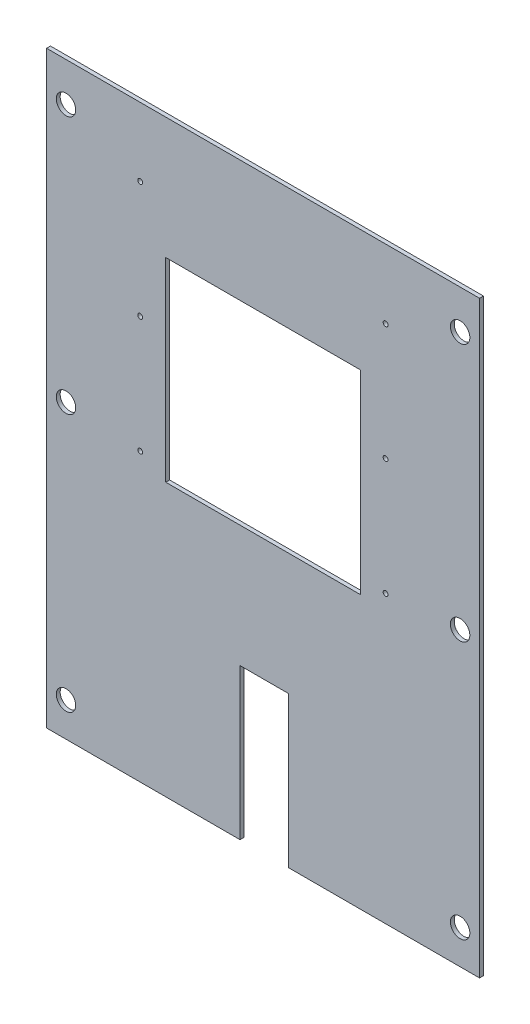
ISO-10303-21;
HEADER;
FILE_DESCRIPTION(('STEP AP214'),'2;1');
FILE_NAME('part.step','',(''),(''),'','','');
FILE_SCHEMA(('AUTOMOTIVE_DESIGN { 1 0 10303 214 1 1 1 1 }'));
ENDSEC;
DATA;
#1=APPLICATION_CONTEXT('core data for automotive mechanical design processes');
#2=APPLICATION_PROTOCOL_DEFINITION('international standard','automotive_design',2000,#1);
#3=PRODUCT_CONTEXT('',#1,'mechanical');
#4=PRODUCT('Part','Part','',(#3));
#5=PRODUCT_RELATED_PRODUCT_CATEGORY('part','',(#4));
#6=PRODUCT_DEFINITION_FORMATION('','',#4);
#7=PRODUCT_DEFINITION_CONTEXT('part definition',#1,'design');
#8=PRODUCT_DEFINITION('design','',#6,#7);
#9=PRODUCT_DEFINITION_SHAPE('','',#8);
#10=(LENGTH_UNIT() NAMED_UNIT(*) SI_UNIT(.MILLI.,.METRE.));
#11=(NAMED_UNIT(*) PLANE_ANGLE_UNIT() SI_UNIT($,.RADIAN.));
#12=(NAMED_UNIT(*) SI_UNIT($,.STERADIAN.) SOLID_ANGLE_UNIT());
#13=UNCERTAINTY_MEASURE_WITH_UNIT(LENGTH_MEASURE(1.E-05),#10,'distance_accuracy_value','');
#14=(GEOMETRIC_REPRESENTATION_CONTEXT(3) GLOBAL_UNCERTAINTY_ASSIGNED_CONTEXT((#13)) GLOBAL_UNIT_ASSIGNED_CONTEXT((#10,
#11,#12)) REPRESENTATION_CONTEXT('',''));
#15=CARTESIAN_POINT('',(0.,0.,0.));
#16=DIRECTION('',(0.,0.,1.));
#17=DIRECTION('',(1.,0.,0.));
#18=AXIS2_PLACEMENT_3D('',#15,#16,#17);
#19=CARTESIAN_POINT('',(0.,-93.6625,2.54));
#20=DIRECTION('',(0.,1.,0.));
#21=DIRECTION('',(-1.,0.,0.));
#22=AXIS2_PLACEMENT_3D('',#19,#20,#21);
#23=PLANE('',#22);
#24=DIRECTION('',(1.,0.,0.));
#25=VECTOR('',#24,1.);
#26=CARTESIAN_POINT('',(0.,-93.6625,0.));
#27=LINE('',#26,#25);
#28=CARTESIAN_POINT('',(-15.0081933746558,-93.6625,0.));
#29=VERTEX_POINT('',#28);
#30=CARTESIAN_POINT('',(16.7418066253443,-93.6625,0.));
#31=VERTEX_POINT('',#30);
#32=EDGE_CURVE('E261',#29,#31,#27,.T.);
#33=ORIENTED_EDGE('',*,*,#32,.T.);
#34=DIRECTION('',(0.,0.,-1.));
#35=VECTOR('',#34,1.);
#36=CARTESIAN_POINT('',(16.7418066253443,-93.6625,2.54));
#37=LINE('',#36,#35);
#38=CARTESIAN_POINT('',(16.7418066253443,-93.6625,2.54));
#39=VERTEX_POINT('',#38);
#40=EDGE_CURVE('E11',#39,#31,#37,.T.);
#41=ORIENTED_EDGE('',*,*,#40,.F.);
#42=DIRECTION('',(1.,0.,0.));
#43=VECTOR('',#42,1.);
#44=CARTESIAN_POINT('',(0.,-93.6625,2.54));
#45=LINE('',#44,#43);
#46=CARTESIAN_POINT('',(-15.0081933746558,-93.6625,2.54));
#47=VERTEX_POINT('',#46);
#48=EDGE_CURVE('E172',#47,#39,#45,.T.);
#49=ORIENTED_EDGE('',*,*,#48,.F.);
#50=DIRECTION('',(0.,0.,-1.));
#51=VECTOR('',#50,1.);
#52=CARTESIAN_POINT('',(-15.0081933746558,-93.6625,2.54));
#53=LINE('',#52,#51);
#54=EDGE_CURVE('E218',#47,#29,#53,.T.);
#55=ORIENTED_EDGE('',*,*,#54,.T.);
#56=EDGE_LOOP('',(#33,#41,#49,#55));
#57=FACE_BOUND('',#56,.T.);
#58=ADVANCED_FACE('F40',(#57),#23,.F.);
#59=CARTESIAN_POINT('',(16.7418066253443,0.,2.54));
#60=DIRECTION('',(1.,0.,0.));
#61=DIRECTION('',(0.,1.,0.));
#62=AXIS2_PLACEMENT_3D('',#59,#60,#61);
#63=PLANE('',#62);
#64=DIRECTION('',(0.,-1.,0.));
#65=VECTOR('',#64,1.);
#66=CARTESIAN_POINT('',(16.7418066253443,0.,0.));
#67=LINE('',#66,#65);
#68=CARTESIAN_POINT('',(16.7418066253443,-192.0875,0.));
#69=VERTEX_POINT('',#68);
#70=EDGE_CURVE('E264',#31,#69,#67,.T.);
#71=ORIENTED_EDGE('',*,*,#70,.T.);
#72=DIRECTION('',(0.,0.,-1.));
#73=VECTOR('',#72,1.);
#74=CARTESIAN_POINT('',(16.7418066253443,-192.0875,2.54));
#75=LINE('',#74,#73);
#76=CARTESIAN_POINT('',(16.7418066253443,-192.0875,2.54));
#77=VERTEX_POINT('',#76);
#78=EDGE_CURVE('E50',#77,#69,#75,.T.);
#79=ORIENTED_EDGE('',*,*,#78,.F.);
#80=DIRECTION('',(0.,-1.,0.));
#81=VECTOR('',#80,1.);
#82=CARTESIAN_POINT('',(16.7418066253443,0.,2.54));
#83=LINE('',#82,#81);
#84=EDGE_CURVE('E168',#39,#77,#83,.T.);
#85=ORIENTED_EDGE('',*,*,#84,.F.);
#86=ORIENTED_EDGE('',*,*,#40,.T.);
#87=EDGE_LOOP('',(#71,#79,#85,#86));
#88=FACE_BOUND('',#87,.T.);
#89=ADVANCED_FACE('F306',(#88),#63,.F.);
#90=CARTESIAN_POINT('',(0.,-192.0875,2.54));
#91=DIRECTION('',(0.,1.,0.));
#92=DIRECTION('',(0.,0.,1.));
#93=AXIS2_PLACEMENT_3D('',#90,#91,#92);
#94=PLANE('',#93);
#95=DIRECTION('',(1.,0.,0.));
#96=VECTOR('',#95,1.);
#97=CARTESIAN_POINT('',(0.,-192.0875,0.));
#98=LINE('',#97,#96);
#99=CARTESIAN_POINT('',(141.2875,-192.0875,0.));
#100=VERTEX_POINT('',#99);
#101=EDGE_CURVE('E266',#69,#100,#98,.T.);
#102=ORIENTED_EDGE('',*,*,#101,.T.);
#103=DIRECTION('',(0.,0.,-1.));
#104=VECTOR('',#103,1.);
#105=CARTESIAN_POINT('',(141.2875,-192.0875,2.54));
#106=LINE('',#105,#104);
#107=CARTESIAN_POINT('',(141.2875,-192.0875,2.54));
#108=VERTEX_POINT('',#107);
#109=EDGE_CURVE('E224',#108,#100,#106,.T.);
#110=ORIENTED_EDGE('',*,*,#109,.F.);
#111=DIRECTION('',(1.,0.,0.));
#112=VECTOR('',#111,1.);
#113=CARTESIAN_POINT('',(0.,-192.0875,2.54));
#114=LINE('',#113,#112);
#115=EDGE_CURVE('E162',#77,#108,#114,.T.);
#116=ORIENTED_EDGE('',*,*,#115,.F.);
#117=ORIENTED_EDGE('',*,*,#78,.T.);
#118=EDGE_LOOP('',(#102,#110,#116,#117));
#119=FACE_BOUND('',#118,.T.);
#120=ADVANCED_FACE('F312',(#119),#94,.F.);
#121=CARTESIAN_POINT('',(141.2875,0.,2.54));
#122=DIRECTION('',(1.,0.,0.));
#123=DIRECTION('',(0.,1.,0.));
#124=AXIS2_PLACEMENT_3D('',#121,#122,#123);
#125=PLANE('',#124);
#126=DIRECTION('',(0.,-1.,0.));
#127=VECTOR('',#126,1.);
#128=CARTESIAN_POINT('',(141.2875,0.,0.));
#129=LINE('',#128,#127);
#130=CARTESIAN_POINT('',(141.2875,192.0875,0.));
#131=VERTEX_POINT('',#130);
#132=EDGE_CURVE('E269',#131,#100,#129,.T.);
#133=ORIENTED_EDGE('',*,*,#132,.F.);
#134=DIRECTION('',(0.,0.,-1.));
#135=VECTOR('',#134,1.);
#136=CARTESIAN_POINT('',(141.2875,192.0875,2.54));
#137=LINE('',#136,#135);
#138=CARTESIAN_POINT('',(141.2875,192.0875,2.54));
#139=VERTEX_POINT('',#138);
#140=EDGE_CURVE('E222',#139,#131,#137,.T.);
#141=ORIENTED_EDGE('',*,*,#140,.F.);
#142=DIRECTION('',(0.,-1.,0.));
#143=VECTOR('',#142,1.);
#144=CARTESIAN_POINT('',(141.2875,0.,2.54));
#145=LINE('',#144,#143);
#146=EDGE_CURVE('E167',#139,#108,#145,.T.);
#147=ORIENTED_EDGE('',*,*,#146,.T.);
#148=ORIENTED_EDGE('',*,*,#109,.T.);
#149=EDGE_LOOP('',(#133,#141,#147,#148));
#150=FACE_BOUND('',#149,.T.);
#151=ADVANCED_FACE('F406',(#150),#125,.T.);
#152=CARTESIAN_POINT('',(0.,192.0875,2.54));
#153=DIRECTION('',(0.,1.,0.));
#154=DIRECTION('',(0.,0.,1.));
#155=AXIS2_PLACEMENT_3D('',#152,#153,#154);
#156=PLANE('',#155);
#157=DIRECTION('',(1.,0.,0.));
#158=VECTOR('',#157,1.);
#159=CARTESIAN_POINT('',(0.,192.0875,0.));
#160=LINE('',#159,#158);
#161=CARTESIAN_POINT('',(-141.2875,192.0875,0.));
#162=VERTEX_POINT('',#161);
#163=EDGE_CURVE('E272',#162,#131,#160,.T.);
#164=ORIENTED_EDGE('',*,*,#163,.F.);
#165=DIRECTION('',(0.,0.,-1.));
#166=VECTOR('',#165,1.);
#167=CARTESIAN_POINT('',(-141.2875,192.0875,2.54));
#168=LINE('',#167,#166);
#169=CARTESIAN_POINT('',(-141.2875,192.0875,2.54));
#170=VERTEX_POINT('',#169);
#171=EDGE_CURVE('E157',#170,#162,#168,.T.);
#172=ORIENTED_EDGE('',*,*,#171,.F.);
#173=DIRECTION('',(1.,0.,0.));
#174=VECTOR('',#173,1.);
#175=CARTESIAN_POINT('',(0.,192.0875,2.54));
#176=LINE('',#175,#174);
#177=EDGE_CURVE('E150',#170,#139,#176,.T.);
#178=ORIENTED_EDGE('',*,*,#177,.T.);
#179=ORIENTED_EDGE('',*,*,#140,.T.);
#180=EDGE_LOOP('',(#164,#172,#178,#179));
#181=FACE_BOUND('',#180,.T.);
#182=ADVANCED_FACE('F404',(#181),#156,.T.);
#183=CARTESIAN_POINT('',(-141.2875,0.,2.54));
#184=DIRECTION('',(1.,0.,0.));
#185=DIRECTION('',(0.,1.,0.));
#186=AXIS2_PLACEMENT_3D('',#183,#184,#185);
#187=PLANE('',#186);
#188=DIRECTION('',(0.,-1.,0.));
#189=VECTOR('',#188,1.);
#190=CARTESIAN_POINT('',(-141.2875,0.,0.));
#191=LINE('',#190,#189);
#192=CARTESIAN_POINT('',(-141.2875,-192.0875,0.));
#193=VERTEX_POINT('',#192);
#194=EDGE_CURVE('E156',#162,#193,#191,.T.);
#195=ORIENTED_EDGE('',*,*,#194,.T.);
#196=DIRECTION('',(0.,0.,-1.));
#197=VECTOR('',#196,1.);
#198=CARTESIAN_POINT('',(-141.2875,-192.0875,2.54));
#199=LINE('',#198,#197);
#200=CARTESIAN_POINT('',(-141.2875,-192.0875,2.54));
#201=VERTEX_POINT('',#200);
#202=EDGE_CURVE('E153',#201,#193,#199,.T.);
#203=ORIENTED_EDGE('',*,*,#202,.F.);
#204=DIRECTION('',(0.,-1.,0.));
#205=VECTOR('',#204,1.);
#206=CARTESIAN_POINT('',(-141.2875,0.,2.54));
#207=LINE('',#206,#205);
#208=EDGE_CURVE('E142',#170,#201,#207,.T.);
#209=ORIENTED_EDGE('',*,*,#208,.F.);
#210=ORIENTED_EDGE('',*,*,#171,.T.);
#211=EDGE_LOOP('',(#195,#203,#209,#210));
#212=FACE_BOUND('',#211,.T.);
#213=ADVANCED_FACE('F154',(#212),#187,.F.);
#214=CARTESIAN_POINT('',(-15.0081933746557,-192.0875,0.));
#215=VERTEX_POINT('',#214);
#216=EDGE_CURVE('E100',#193,#215,#98,.T.);
#217=ORIENTED_EDGE('',*,*,#216,.T.);
#218=DIRECTION('',(0.,0.,-1.));
#219=VECTOR('',#218,1.);
#220=CARTESIAN_POINT('',(-15.0081933746557,-192.0875,2.54));
#221=LINE('',#220,#219);
#222=CARTESIAN_POINT('',(-15.0081933746557,-192.0875,2.54));
#223=VERTEX_POINT('',#222);
#224=EDGE_CURVE('E158',#223,#215,#221,.T.);
#225=ORIENTED_EDGE('',*,*,#224,.F.);
#226=EDGE_CURVE('E147',#201,#223,#114,.T.);
#227=ORIENTED_EDGE('',*,*,#226,.F.);
#228=ORIENTED_EDGE('',*,*,#202,.T.);
#229=EDGE_LOOP('',(#217,#225,#227,#228));
#230=FACE_BOUND('',#229,.T.);
#231=ADVANCED_FACE('F160',(#230),#94,.F.);
#232=CARTESIAN_POINT('',(0.,112.7125,2.54));
#233=DIRECTION('',(0.,1.,0.));
#234=DIRECTION('',(0.,0.,1.));
#235=AXIS2_PLACEMENT_3D('',#232,#233,#234);
#236=PLANE('',#235);
#237=DIRECTION('',(1.,0.,0.));
#238=VECTOR('',#237,1.);
#239=CARTESIAN_POINT('',(0.,112.7125,0.));
#240=LINE('',#239,#238);
#241=CARTESIAN_POINT('',(-63.5064023109508,112.7125,0.));
#242=VERTEX_POINT('',#241);
#243=CARTESIAN_POINT('',(63.4935976890492,112.7125,0.));
#244=VERTEX_POINT('',#243);
#245=EDGE_CURVE('E244',#242,#244,#240,.T.);
#246=ORIENTED_EDGE('',*,*,#245,.T.);
#247=DIRECTION('',(0.,0.,-1.));
#248=VECTOR('',#247,1.);
#249=CARTESIAN_POINT('',(63.4935976890492,112.7125,2.54));
#250=LINE('',#249,#248);
#251=CARTESIAN_POINT('',(63.4935976890492,112.7125,2.54));
#252=VERTEX_POINT('',#251);
#253=EDGE_CURVE('E44',#252,#244,#250,.T.);
#254=ORIENTED_EDGE('',*,*,#253,.F.);
#255=DIRECTION('',(1.,0.,0.));
#256=VECTOR('',#255,1.);
#257=CARTESIAN_POINT('',(0.,112.7125,2.54));
#258=LINE('',#257,#256);
#259=CARTESIAN_POINT('',(-63.5064023109508,112.7125,2.54));
#260=VERTEX_POINT('',#259);
#261=EDGE_CURVE('E183',#260,#252,#258,.T.);
#262=ORIENTED_EDGE('',*,*,#261,.F.);
#263=DIRECTION('',(0.,0.,-1.));
#264=VECTOR('',#263,1.);
#265=CARTESIAN_POINT('',(-63.5064023109508,112.7125,2.54));
#266=LINE('',#265,#264);
#267=EDGE_CURVE('E228',#260,#242,#266,.T.);
#268=ORIENTED_EDGE('',*,*,#267,.T.);
#269=EDGE_LOOP('',(#246,#254,#262,#268));
#270=FACE_BOUND('',#269,.T.);
#271=ADVANCED_FACE('F245',(#270),#236,.F.);
#272=CARTESIAN_POINT('',(63.4935976890493,0.,2.54));
#273=DIRECTION('',(1.,0.,0.));
#274=DIRECTION('',(0.,1.,0.));
#275=AXIS2_PLACEMENT_3D('',#272,#273,#274);
#276=PLANE('',#275);
#277=DIRECTION('',(0.,-1.,0.));
#278=VECTOR('',#277,1.);
#279=CARTESIAN_POINT('',(63.4935976890493,0.,0.));
#280=LINE('',#279,#278);
#281=CARTESIAN_POINT('',(63.4935976890493,-14.2875,0.));
#282=VERTEX_POINT('',#281);
#283=EDGE_CURVE('E239',#244,#282,#280,.T.);
#284=ORIENTED_EDGE('',*,*,#283,.T.);
#285=DIRECTION('',(0.,0.,-1.));
#286=VECTOR('',#285,1.);
#287=CARTESIAN_POINT('',(63.4935976890493,-14.2875,2.54));
#288=LINE('',#287,#286);
#289=CARTESIAN_POINT('',(63.4935976890493,-14.2875,2.54));
#290=VERTEX_POINT('',#289);
#291=EDGE_CURVE('E232',#290,#282,#288,.T.);
#292=ORIENTED_EDGE('',*,*,#291,.F.);
#293=DIRECTION('',(0.,-1.,0.));
#294=VECTOR('',#293,1.);
#295=CARTESIAN_POINT('',(63.4935976890493,0.,2.54));
#296=LINE('',#295,#294);
#297=EDGE_CURVE('E115',#252,#290,#296,.T.);
#298=ORIENTED_EDGE('',*,*,#297,.F.);
#299=ORIENTED_EDGE('',*,*,#253,.T.);
#300=EDGE_LOOP('',(#284,#292,#298,#299));
#301=FACE_BOUND('',#300,.T.);
#302=ADVANCED_FACE('F238',(#301),#276,.F.);
#303=CARTESIAN_POINT('',(0.,-14.2875,2.54));
#304=DIRECTION('',(0.,1.,0.));
#305=DIRECTION('',(0.,0.,1.));
#306=AXIS2_PLACEMENT_3D('',#303,#304,#305);
#307=PLANE('',#306);
#308=DIRECTION('',(1.,0.,0.));
#309=VECTOR('',#308,1.);
#310=CARTESIAN_POINT('',(0.,-14.2875,0.));
#311=LINE('',#310,#309);
#312=CARTESIAN_POINT('',(-63.5064023109508,-14.2875,0.));
#313=VERTEX_POINT('',#312);
#314=EDGE_CURVE('E251',#313,#282,#311,.T.);
#315=ORIENTED_EDGE('',*,*,#314,.F.);
#316=DIRECTION('',(0.,0.,-1.));
#317=VECTOR('',#316,1.);
#318=CARTESIAN_POINT('',(-63.5064023109508,-14.2875,2.54));
#319=LINE('',#318,#317);
#320=CARTESIAN_POINT('',(-63.5064023109508,-14.2875,2.54));
#321=VERTEX_POINT('',#320);
#322=EDGE_CURVE('E230',#321,#313,#319,.T.);
#323=ORIENTED_EDGE('',*,*,#322,.F.);
#324=DIRECTION('',(1.,0.,0.));
#325=VECTOR('',#324,1.);
#326=CARTESIAN_POINT('',(0.,-14.2875,2.54));
#327=LINE('',#326,#325);
#328=EDGE_CURVE('E179',#321,#290,#327,.T.);
#329=ORIENTED_EDGE('',*,*,#328,.T.);
#330=ORIENTED_EDGE('',*,*,#291,.T.);
#331=EDGE_LOOP('',(#315,#323,#329,#330));
#332=FACE_BOUND('',#331,.T.);
#333=ADVANCED_FACE('F301',(#332),#307,.T.);
#334=CARTESIAN_POINT('',(128.5875,-1.58749999999996,2.54));
#335=DIRECTION('',(0.,0.,-1.));
#336=DIRECTION('',(-1.,0.,0.));
#337=AXIS2_PLACEMENT_3D('',#334,#335,#336);
#338=CYLINDRICAL_SURFACE('',#337,6.35);
#339=CARTESIAN_POINT('',(128.5875,-1.58749999999996,2.54));
#340=DIRECTION('',(0.,0.,1.));
#341=DIRECTION('',(1.,0.,0.));
#342=AXIS2_PLACEMENT_3D('',#339,#340,#341);
#343=CIRCLE('',#342,6.35);
#344=CARTESIAN_POINT('',(134.9375,-1.58749999999996,2.54));
#345=VERTEX_POINT('',#344);
#346=EDGE_CURVE('E425',#345,#345,#343,.F.);
#347=ORIENTED_EDGE('',*,*,#346,.F.);
#348=EDGE_LOOP('',(#347));
#349=FACE_BOUND('',#348,.T.);
#350=CARTESIAN_POINT('',(128.5875,-1.58749999999996,0.));
#351=DIRECTION('',(0.,0.,1.));
#352=DIRECTION('',(1.,0.,0.));
#353=AXIS2_PLACEMENT_3D('',#350,#351,#352);
#354=CIRCLE('',#353,6.35);
#355=CARTESIAN_POINT('',(134.9375,-1.58749999999996,0.));
#356=VERTEX_POINT('',#355);
#357=EDGE_CURVE('E209',#356,#356,#354,.F.);
#358=ORIENTED_EDGE('',*,*,#357,.T.);
#359=EDGE_LOOP('',(#358));
#360=FACE_BOUND('',#359,.T.);
#361=ADVANCED_FACE('F291',(#349,#360),#338,.F.);
#362=CARTESIAN_POINT('',(-128.5875,-169.8625,2.54));
#363=DIRECTION('',(0.,0.,-1.));
#364=DIRECTION('',(-1.,0.,0.));
#365=AXIS2_PLACEMENT_3D('',#362,#363,#364);
#366=CYLINDRICAL_SURFACE('',#365,6.34999999999999);
#367=CARTESIAN_POINT('',(-128.5875,-169.8625,2.54));
#368=DIRECTION('',(0.,0.,1.));
#369=DIRECTION('',(1.,0.,0.));
#370=AXIS2_PLACEMENT_3D('',#367,#368,#369);
#371=CIRCLE('',#370,6.34999999999999);
#372=CARTESIAN_POINT('',(-122.2375,-169.8625,2.54));
#373=VERTEX_POINT('',#372);
#374=EDGE_CURVE('E423',#373,#373,#371,.T.);
#375=ORIENTED_EDGE('',*,*,#374,.T.);
#376=EDGE_LOOP('',(#375));
#377=FACE_BOUND('',#376,.T.);
#378=CARTESIAN_POINT('',(-128.5875,-169.8625,0.));
#379=DIRECTION('',(0.,0.,1.));
#380=DIRECTION('',(1.,0.,0.));
#381=AXIS2_PLACEMENT_3D('',#378,#379,#380);
#382=CIRCLE('',#381,6.34999999999999);
#383=CARTESIAN_POINT('',(-122.2375,-169.8625,0.));
#384=VERTEX_POINT('',#383);
#385=EDGE_CURVE('E214',#384,#384,#382,.T.);
#386=ORIENTED_EDGE('',*,*,#385,.F.);
#387=EDGE_LOOP('',(#386));
#388=FACE_BOUND('',#387,.T.);
#389=ADVANCED_FACE('F288',(#377,#388),#366,.F.);
#390=CARTESIAN_POINT('',(-128.5875,-1.58750000000002,2.54));
#391=DIRECTION('',(0.,0.,-1.));
#392=DIRECTION('',(-1.,0.,0.));
#393=AXIS2_PLACEMENT_3D('',#390,#391,#392);
#394=CYLINDRICAL_SURFACE('',#393,6.35);
#395=CARTESIAN_POINT('',(-128.5875,-1.58750000000002,2.54));
#396=DIRECTION('',(0.,0.,1.));
#397=DIRECTION('',(1.,0.,0.));
#398=AXIS2_PLACEMENT_3D('',#395,#396,#397);
#399=CIRCLE('',#398,6.35);
#400=CARTESIAN_POINT('',(-122.2375,-1.58750000000002,2.54));
#401=VERTEX_POINT('',#400);
#402=EDGE_CURVE('E420',#401,#401,#399,.T.);
#403=ORIENTED_EDGE('',*,*,#402,.T.);
#404=EDGE_LOOP('',(#403));
#405=FACE_BOUND('',#404,.T.);
#406=CARTESIAN_POINT('',(-128.5875,-1.58750000000002,0.));
#407=DIRECTION('',(0.,0.,1.));
#408=DIRECTION('',(1.,0.,0.));
#409=AXIS2_PLACEMENT_3D('',#406,#407,#408);
#410=CIRCLE('',#409,6.35);
#411=CARTESIAN_POINT('',(-122.2375,-1.58750000000002,0.));
#412=VERTEX_POINT('',#411);
#413=EDGE_CURVE('E280',#412,#412,#410,.T.);
#414=ORIENTED_EDGE('',*,*,#413,.F.);
#415=EDGE_LOOP('',(#414));
#416=FACE_BOUND('',#415,.T.);
#417=ADVANCED_FACE('F290',(#405,#416),#394,.F.);
#418=CARTESIAN_POINT('',(-128.5875,166.6875,2.54));
#419=DIRECTION('',(0.,0.,-1.));
#420=DIRECTION('',(-1.,0.,0.));
#421=AXIS2_PLACEMENT_3D('',#418,#419,#420);
#422=CYLINDRICAL_SURFACE('',#421,6.34999999999999);
#423=CARTESIAN_POINT('',(-128.5875,166.6875,2.54));
#424=DIRECTION('',(0.,0.,1.));
#425=DIRECTION('',(1.,0.,0.));
#426=AXIS2_PLACEMENT_3D('',#423,#424,#425);
#427=CIRCLE('',#426,6.34999999999999);
#428=CARTESIAN_POINT('',(-122.2375,166.6875,2.54));
#429=VERTEX_POINT('',#428);
#430=EDGE_CURVE('E163',#429,#429,#427,.T.);
#431=ORIENTED_EDGE('',*,*,#430,.T.);
#432=EDGE_LOOP('',(#431));
#433=FACE_BOUND('',#432,.T.);
#434=CARTESIAN_POINT('',(-128.5875,166.6875,0.));
#435=DIRECTION('',(0.,0.,1.));
#436=DIRECTION('',(1.,0.,0.));
#437=AXIS2_PLACEMENT_3D('',#434,#435,#436);
#438=CIRCLE('',#437,6.34999999999999);
#439=CARTESIAN_POINT('',(-122.2375,166.6875,0.));
#440=VERTEX_POINT('',#439);
#441=EDGE_CURVE('E277',#440,#440,#438,.T.);
#442=ORIENTED_EDGE('',*,*,#441,.F.);
#443=EDGE_LOOP('',(#442));
#444=FACE_BOUND('',#443,.T.);
#445=ADVANCED_FACE('F298',(#433,#444),#422,.F.);
#446=CARTESIAN_POINT('',(-15.0081933746558,0.,2.54));
#447=DIRECTION('',(-1.,0.,0.));
#448=DIRECTION('',(0.,-1.,0.));
#449=AXIS2_PLACEMENT_3D('',#446,#447,#448);
#450=PLANE('',#449);
#451=DIRECTION('',(0.,1.,0.));
#452=VECTOR('',#451,1.);
#453=CARTESIAN_POINT('',(-15.0081933746558,0.,0.));
#454=LINE('',#453,#452);
#455=EDGE_CURVE('E106',#215,#29,#454,.T.);
#456=ORIENTED_EDGE('',*,*,#455,.T.);
#457=ORIENTED_EDGE('',*,*,#54,.F.);
#458=DIRECTION('',(0.,1.,0.));
#459=VECTOR('',#458,1.);
#460=CARTESIAN_POINT('',(-15.0081933746558,0.,2.54));
#461=LINE('',#460,#459);
#462=EDGE_CURVE('E59',#223,#47,#461,.T.);
#463=ORIENTED_EDGE('',*,*,#462,.F.);
#464=ORIENTED_EDGE('',*,*,#224,.T.);
#465=EDGE_LOOP('',(#456,#457,#463,#464));
#466=FACE_BOUND('',#465,.T.);
#467=ADVANCED_FACE('F321',(#466),#450,.F.);
#468=CARTESIAN_POINT('',(-63.5064023109508,0.,2.54));
#469=DIRECTION('',(1.,0.,0.));
#470=DIRECTION('',(0.,0.,-1.));
#471=AXIS2_PLACEMENT_3D('',#468,#469,#470);
#472=PLANE('',#471);
#473=DIRECTION('',(0.,-1.,0.));
#474=VECTOR('',#473,1.);
#475=CARTESIAN_POINT('',(-63.5064023109508,0.,0.));
#476=LINE('',#475,#474);
#477=EDGE_CURVE('E259',#242,#313,#476,.T.);
#478=ORIENTED_EDGE('',*,*,#477,.F.);
#479=ORIENTED_EDGE('',*,*,#267,.F.);
#480=DIRECTION('',(0.,-1.,0.));
#481=VECTOR('',#480,1.);
#482=CARTESIAN_POINT('',(-63.5064023109508,0.,2.54));
#483=LINE('',#482,#481);
#484=EDGE_CURVE('E174',#260,#321,#483,.T.);
#485=ORIENTED_EDGE('',*,*,#484,.T.);
#486=ORIENTED_EDGE('',*,*,#322,.T.);
#487=EDGE_LOOP('',(#478,#479,#485,#486));
#488=FACE_BOUND('',#487,.T.);
#489=ADVANCED_FACE('F317',(#488),#472,.T.);
#490=CARTESIAN_POINT('',(128.5875,166.6875,2.54));
#491=DIRECTION('',(0.,0.,-1.));
#492=DIRECTION('',(-1.,0.,0.));
#493=AXIS2_PLACEMENT_3D('',#490,#491,#492);
#494=CYLINDRICAL_SURFACE('',#493,6.34999999999999);
#495=CARTESIAN_POINT('',(128.5875,166.6875,2.54));
#496=DIRECTION('',(0.,0.,1.));
#497=DIRECTION('',(1.,0.,0.));
#498=AXIS2_PLACEMENT_3D('',#495,#496,#497);
#499=CIRCLE('',#498,6.34999999999999);
#500=CARTESIAN_POINT('',(134.9375,166.6875,2.54));
#501=VERTEX_POINT('',#500);
#502=EDGE_CURVE('E185',#501,#501,#499,.F.);
#503=ORIENTED_EDGE('',*,*,#502,.F.);
#504=EDGE_LOOP('',(#503));
#505=FACE_BOUND('',#504,.T.);
#506=CARTESIAN_POINT('',(128.5875,166.6875,0.));
#507=DIRECTION('',(0.,0.,1.));
#508=DIRECTION('',(1.,0.,0.));
#509=AXIS2_PLACEMENT_3D('',#506,#507,#508);
#510=CIRCLE('',#509,6.34999999999999);
#511=CARTESIAN_POINT('',(134.9375,166.6875,0.));
#512=VERTEX_POINT('',#511);
#513=EDGE_CURVE('E249',#512,#512,#510,.F.);
#514=ORIENTED_EDGE('',*,*,#513,.T.);
#515=EDGE_LOOP('',(#514));
#516=FACE_BOUND('',#515,.T.);
#517=ADVANCED_FACE('F320',(#505,#516),#494,.F.);
#518=CARTESIAN_POINT('',(-80.1751523109518,147.376386757124,2.54));
#519=DIRECTION('',(0.,0.,-1.));
#520=DIRECTION('',(-1.,0.,0.));
#521=AXIS2_PLACEMENT_3D('',#518,#519,#520);
#522=CYLINDRICAL_SURFACE('',#521,1.58750000005452);
#523=CARTESIAN_POINT('',(-80.1751523109518,147.376386757124,2.54));
#524=DIRECTION('',(0.,0.,1.));
#525=DIRECTION('',(1.,0.,0.));
#526=AXIS2_PLACEMENT_3D('',#523,#524,#525);
#527=CIRCLE('',#526,1.58750000005452);
#528=CARTESIAN_POINT('',(-78.5876523108973,147.376386757124,2.54));
#529=VERTEX_POINT('',#528);
#530=EDGE_CURVE('E188',#529,#529,#527,.T.);
#531=ORIENTED_EDGE('',*,*,#530,.T.);
#532=EDGE_LOOP('',(#531));
#533=FACE_BOUND('',#532,.T.);
#534=CARTESIAN_POINT('',(-80.1751523109518,147.376386757124,0.));
#535=DIRECTION('',(0.,0.,1.));
#536=DIRECTION('',(1.,0.,0.));
#537=AXIS2_PLACEMENT_3D('',#534,#535,#536);
#538=CIRCLE('',#537,1.58750000005452);
#539=CARTESIAN_POINT('',(-78.5876523108973,147.376386757124,0.));
#540=VERTEX_POINT('',#539);
#541=EDGE_CURVE('E254',#540,#540,#538,.T.);
#542=ORIENTED_EDGE('',*,*,#541,.F.);
#543=EDGE_LOOP('',(#542));
#544=FACE_BOUND('',#543,.T.);
#545=ADVANCED_FACE('F331',(#533,#544),#522,.F.);
#546=CARTESIAN_POINT('',(-80.1751523109513,71.1763867571244,2.54));
#547=DIRECTION('',(0.,0.,-1.));
#548=DIRECTION('',(-1.,0.,0.));
#549=AXIS2_PLACEMENT_3D('',#546,#547,#548);
#550=CYLINDRICAL_SURFACE('',#549,1.5875000000545);
#551=CARTESIAN_POINT('',(-80.1751523109513,71.1763867571244,2.54));
#552=DIRECTION('',(0.,0.,1.));
#553=DIRECTION('',(1.,0.,0.));
#554=AXIS2_PLACEMENT_3D('',#551,#552,#553);
#555=CIRCLE('',#554,1.5875000000545);
#556=CARTESIAN_POINT('',(-78.5876523108968,71.1763867571244,2.54));
#557=VERTEX_POINT('',#556);
#558=EDGE_CURVE('E191',#557,#557,#555,.T.);
#559=ORIENTED_EDGE('',*,*,#558,.T.);
#560=EDGE_LOOP('',(#559));
#561=FACE_BOUND('',#560,.T.);
#562=CARTESIAN_POINT('',(-80.1751523109513,71.1763867571244,0.));
#563=DIRECTION('',(0.,0.,1.));
#564=DIRECTION('',(1.,0.,0.));
#565=AXIS2_PLACEMENT_3D('',#562,#563,#564);
#566=CIRCLE('',#565,1.5875000000545);
#567=CARTESIAN_POINT('',(-78.5876523108968,71.1763867571244,0.));
#568=VERTEX_POINT('',#567);
#569=EDGE_CURVE('E372',#568,#568,#566,.T.);
#570=ORIENTED_EDGE('',*,*,#569,.F.);
#571=EDGE_LOOP('',(#570));
#572=FACE_BOUND('',#571,.T.);
#573=ADVANCED_FACE('F335',(#561,#572),#550,.F.);
#574=CARTESIAN_POINT('',(-80.1751523109507,-5.02361324287556,2.54));
#575=DIRECTION('',(0.,0.,-1.));
#576=DIRECTION('',(-1.,0.,0.));
#577=AXIS2_PLACEMENT_3D('',#574,#575,#576);
#578=CYLINDRICAL_SURFACE('',#577,1.58750000005448);
#579=CARTESIAN_POINT('',(-80.1751523109507,-5.02361324287556,2.54));
#580=DIRECTION('',(0.,0.,1.));
#581=DIRECTION('',(1.,0.,0.));
#582=AXIS2_PLACEMENT_3D('',#579,#580,#581);
#583=CIRCLE('',#582,1.58750000005448);
#584=CARTESIAN_POINT('',(-78.5876523108962,-5.02361324287556,2.54));
#585=VERTEX_POINT('',#584);
#586=EDGE_CURVE('E194',#585,#585,#583,.T.);
#587=ORIENTED_EDGE('',*,*,#586,.T.);
#588=EDGE_LOOP('',(#587));
#589=FACE_BOUND('',#588,.T.);
#590=CARTESIAN_POINT('',(-80.1751523109507,-5.02361324287556,0.));
#591=DIRECTION('',(0.,0.,1.));
#592=DIRECTION('',(1.,0.,0.));
#593=AXIS2_PLACEMENT_3D('',#590,#591,#592);
#594=CIRCLE('',#593,1.58750000005448);
#595=CARTESIAN_POINT('',(-78.5876523108962,-5.02361324287556,0.));
#596=VERTEX_POINT('',#595);
#597=EDGE_CURVE('E364',#596,#596,#594,.T.);
#598=ORIENTED_EDGE('',*,*,#597,.F.);
#599=EDGE_LOOP('',(#598));
#600=FACE_BOUND('',#599,.T.);
#601=ADVANCED_FACE('F339',(#589,#600),#578,.F.);
#602=CARTESIAN_POINT('',(79.9706504994258,-5.39516449430694,2.54));
#603=DIRECTION('',(0.,0.,-1.));
#604=DIRECTION('',(-1.,0.,0.));
#605=AXIS2_PLACEMENT_3D('',#602,#603,#604);
#606=CYLINDRICAL_SURFACE('',#605,1.58749999999999);
#607=CARTESIAN_POINT('',(79.9706504994258,-5.39516449430694,2.54));
#608=DIRECTION('',(0.,0.,1.));
#609=DIRECTION('',(1.,0.,0.));
#610=AXIS2_PLACEMENT_3D('',#607,#608,#609);
#611=CIRCLE('',#610,1.58749999999999);
#612=CARTESIAN_POINT('',(81.5581504994258,-5.39516449430694,2.54));
#613=VERTEX_POINT('',#612);
#614=EDGE_CURVE('E197',#613,#613,#611,.T.);
#615=ORIENTED_EDGE('',*,*,#614,.T.);
#616=EDGE_LOOP('',(#615));
#617=FACE_BOUND('',#616,.T.);
#618=CARTESIAN_POINT('',(79.9706504994258,-5.39516449430694,0.));
#619=DIRECTION('',(0.,0.,1.));
#620=DIRECTION('',(1.,0.,0.));
#621=AXIS2_PLACEMENT_3D('',#618,#619,#620);
#622=CIRCLE('',#621,1.58749999999999);
#623=CARTESIAN_POINT('',(81.5581504994258,-5.39516449430694,0.));
#624=VERTEX_POINT('',#623);
#625=EDGE_CURVE('E360',#624,#624,#622,.T.);
#626=ORIENTED_EDGE('',*,*,#625,.F.);
#627=EDGE_LOOP('',(#626));
#628=FACE_BOUND('',#627,.T.);
#629=ADVANCED_FACE('F343',(#617,#628),#606,.F.);
#630=CARTESIAN_POINT('',(79.9706504994258,70.804835505693,2.54));
#631=DIRECTION('',(0.,0.,-1.));
#632=DIRECTION('',(-1.,0.,0.));
#633=AXIS2_PLACEMENT_3D('',#630,#631,#632);
#634=CYLINDRICAL_SURFACE('',#633,1.58749999999999);
#635=CARTESIAN_POINT('',(79.9706504994258,70.804835505693,2.54));
#636=DIRECTION('',(0.,0.,1.));
#637=DIRECTION('',(1.,0.,0.));
#638=AXIS2_PLACEMENT_3D('',#635,#636,#637);
#639=CIRCLE('',#638,1.58749999999999);
#640=CARTESIAN_POINT('',(81.5581504994258,70.804835505693,2.54));
#641=VERTEX_POINT('',#640);
#642=EDGE_CURVE('E200',#641,#641,#639,.T.);
#643=ORIENTED_EDGE('',*,*,#642,.T.);
#644=EDGE_LOOP('',(#643));
#645=FACE_BOUND('',#644,.T.);
#646=CARTESIAN_POINT('',(79.9706504994258,70.804835505693,0.));
#647=DIRECTION('',(0.,0.,1.));
#648=DIRECTION('',(1.,0.,0.));
#649=AXIS2_PLACEMENT_3D('',#646,#647,#648);
#650=CIRCLE('',#649,1.58749999999999);
#651=CARTESIAN_POINT('',(81.5581504994258,70.804835505693,0.));
#652=VERTEX_POINT('',#651);
#653=EDGE_CURVE('E358',#652,#652,#650,.T.);
#654=ORIENTED_EDGE('',*,*,#653,.F.);
#655=EDGE_LOOP('',(#654));
#656=FACE_BOUND('',#655,.T.);
#657=ADVANCED_FACE('F346',(#645,#656),#634,.F.);
#658=CARTESIAN_POINT('',(79.9706504994258,147.004835505693,2.54));
#659=DIRECTION('',(0.,0.,-1.));
#660=DIRECTION('',(-1.,0.,0.));
#661=AXIS2_PLACEMENT_3D('',#658,#659,#660);
#662=CYLINDRICAL_SURFACE('',#661,1.58749999999999);
#663=CARTESIAN_POINT('',(79.9706504994258,147.004835505693,2.54));
#664=DIRECTION('',(0.,0.,1.));
#665=DIRECTION('',(1.,0.,0.));
#666=AXIS2_PLACEMENT_3D('',#663,#664,#665);
#667=CIRCLE('',#666,1.58749999999999);
#668=CARTESIAN_POINT('',(81.5581504994258,147.004835505693,2.54));
#669=VERTEX_POINT('',#668);
#670=EDGE_CURVE('E203',#669,#669,#667,.T.);
#671=ORIENTED_EDGE('',*,*,#670,.T.);
#672=EDGE_LOOP('',(#671));
#673=FACE_BOUND('',#672,.T.);
#674=CARTESIAN_POINT('',(79.9706504994258,147.004835505693,0.));
#675=DIRECTION('',(0.,0.,1.));
#676=DIRECTION('',(1.,0.,0.));
#677=AXIS2_PLACEMENT_3D('',#674,#675,#676);
#678=CIRCLE('',#677,1.58749999999999);
#679=CARTESIAN_POINT('',(81.5581504994258,147.004835505693,0.));
#680=VERTEX_POINT('',#679);
#681=EDGE_CURVE('E361',#680,#680,#678,.T.);
#682=ORIENTED_EDGE('',*,*,#681,.F.);
#683=EDGE_LOOP('',(#682));
#684=FACE_BOUND('',#683,.T.);
#685=ADVANCED_FACE('F42',(#673,#684),#662,.F.);
#686=CARTESIAN_POINT('',(128.5875,-169.8625,2.54));
#687=DIRECTION('',(0.,0.,-1.));
#688=DIRECTION('',(-1.,0.,0.));
#689=AXIS2_PLACEMENT_3D('',#686,#687,#688);
#690=CYLINDRICAL_SURFACE('',#689,6.34999999999999);
#691=CARTESIAN_POINT('',(128.5875,-169.8625,2.54));
#692=DIRECTION('',(0.,0.,1.));
#693=DIRECTION('',(1.,0.,0.));
#694=AXIS2_PLACEMENT_3D('',#691,#692,#693);
#695=CIRCLE('',#694,6.34999999999999);
#696=CARTESIAN_POINT('',(134.9375,-169.8625,2.54));
#697=VERTEX_POINT('',#696);
#698=EDGE_CURVE('E231',#697,#697,#695,.F.);
#699=ORIENTED_EDGE('',*,*,#698,.F.);
#700=EDGE_LOOP('',(#699));
#701=FACE_BOUND('',#700,.T.);
#702=CARTESIAN_POINT('',(128.5875,-169.8625,0.));
#703=DIRECTION('',(0.,0.,1.));
#704=DIRECTION('',(1.,0.,0.));
#705=AXIS2_PLACEMENT_3D('',#702,#703,#704);
#706=CIRCLE('',#705,6.34999999999999);
#707=CARTESIAN_POINT('',(134.9375,-169.8625,0.));
#708=VERTEX_POINT('',#707);
#709=EDGE_CURVE('E205',#708,#708,#706,.F.);
#710=ORIENTED_EDGE('',*,*,#709,.T.);
#711=EDGE_LOOP('',(#710));
#712=FACE_BOUND('',#711,.T.);
#713=ADVANCED_FACE('F353',(#701,#712),#690,.F.);
#714=CARTESIAN_POINT('',(0.,0.,2.54));
#715=DIRECTION('',(0.,0.,1.));
#716=DIRECTION('',(1.,0.,0.));
#717=AXIS2_PLACEMENT_3D('',#714,#715,#716);
#718=PLANE('',#717);
#719=ORIENTED_EDGE('',*,*,#670,.F.);
#720=EDGE_LOOP('',(#719));
#721=FACE_BOUND('',#720,.T.);
#722=ORIENTED_EDGE('',*,*,#642,.F.);
#723=EDGE_LOOP('',(#722));
#724=FACE_BOUND('',#723,.T.);
#725=ORIENTED_EDGE('',*,*,#614,.F.);
#726=EDGE_LOOP('',(#725));
#727=FACE_BOUND('',#726,.T.);
#728=ORIENTED_EDGE('',*,*,#586,.F.);
#729=EDGE_LOOP('',(#728));
#730=FACE_BOUND('',#729,.T.);
#731=ORIENTED_EDGE('',*,*,#558,.F.);
#732=EDGE_LOOP('',(#731));
#733=FACE_BOUND('',#732,.T.);
#734=ORIENTED_EDGE('',*,*,#530,.F.);
#735=EDGE_LOOP('',(#734));
#736=FACE_BOUND('',#735,.T.);
#737=ORIENTED_EDGE('',*,*,#502,.T.);
#738=EDGE_LOOP('',(#737));
#739=FACE_BOUND('',#738,.T.);
#740=ORIENTED_EDGE('',*,*,#261,.T.);
#741=ORIENTED_EDGE('',*,*,#297,.T.);
#742=ORIENTED_EDGE('',*,*,#328,.F.);
#743=ORIENTED_EDGE('',*,*,#484,.F.);
#744=EDGE_LOOP('',(#740,#741,#742,#743));
#745=FACE_BOUND('',#744,.T.);
#746=ORIENTED_EDGE('',*,*,#48,.T.);
#747=ORIENTED_EDGE('',*,*,#84,.T.);
#748=ORIENTED_EDGE('',*,*,#115,.T.);
#749=ORIENTED_EDGE('',*,*,#146,.F.);
#750=ORIENTED_EDGE('',*,*,#177,.F.);
#751=ORIENTED_EDGE('',*,*,#208,.T.);
#752=ORIENTED_EDGE('',*,*,#226,.T.);
#753=ORIENTED_EDGE('',*,*,#462,.T.);
#754=EDGE_LOOP('',(#746,#747,#748,#749,#750,#751,#752,#753));
#755=FACE_BOUND('',#754,.T.);
#756=ORIENTED_EDGE('',*,*,#430,.F.);
#757=EDGE_LOOP('',(#756));
#758=FACE_BOUND('',#757,.T.);
#759=ORIENTED_EDGE('',*,*,#402,.F.);
#760=EDGE_LOOP('',(#759));
#761=FACE_BOUND('',#760,.T.);
#762=ORIENTED_EDGE('',*,*,#374,.F.);
#763=EDGE_LOOP('',(#762));
#764=FACE_BOUND('',#763,.T.);
#765=ORIENTED_EDGE('',*,*,#346,.T.);
#766=EDGE_LOOP('',(#765));
#767=FACE_BOUND('',#766,.T.);
#768=ORIENTED_EDGE('',*,*,#698,.T.);
#769=EDGE_LOOP('',(#768));
#770=FACE_BOUND('',#769,.T.);
#771=ADVANCED_FACE('F144',(#721,#724,#727,#730,#733,#736,#739,#745,#755,#758,#761,#764,#767,
#770),#718,.T.);
#772=CARTESIAN_POINT('',(0.,0.,0.));
#773=DIRECTION('',(0.,0.,1.));
#774=DIRECTION('',(1.,0.,0.));
#775=AXIS2_PLACEMENT_3D('',#772,#773,#774);
#776=PLANE('',#775);
#777=ORIENTED_EDGE('',*,*,#681,.T.);
#778=EDGE_LOOP('',(#777));
#779=FACE_BOUND('',#778,.T.);
#780=ORIENTED_EDGE('',*,*,#653,.T.);
#781=EDGE_LOOP('',(#780));
#782=FACE_BOUND('',#781,.T.);
#783=ORIENTED_EDGE('',*,*,#625,.T.);
#784=EDGE_LOOP('',(#783));
#785=FACE_BOUND('',#784,.T.);
#786=ORIENTED_EDGE('',*,*,#597,.T.);
#787=EDGE_LOOP('',(#786));
#788=FACE_BOUND('',#787,.T.);
#789=ORIENTED_EDGE('',*,*,#569,.T.);
#790=EDGE_LOOP('',(#789));
#791=FACE_BOUND('',#790,.T.);
#792=ORIENTED_EDGE('',*,*,#541,.T.);
#793=EDGE_LOOP('',(#792));
#794=FACE_BOUND('',#793,.T.);
#795=ORIENTED_EDGE('',*,*,#513,.F.);
#796=EDGE_LOOP('',(#795));
#797=FACE_BOUND('',#796,.T.);
#798=ORIENTED_EDGE('',*,*,#245,.F.);
#799=ORIENTED_EDGE('',*,*,#477,.T.);
#800=ORIENTED_EDGE('',*,*,#314,.T.);
#801=ORIENTED_EDGE('',*,*,#283,.F.);
#802=EDGE_LOOP('',(#798,#799,#800,#801));
#803=FACE_BOUND('',#802,.T.);
#804=ORIENTED_EDGE('',*,*,#32,.F.);
#805=ORIENTED_EDGE('',*,*,#455,.F.);
#806=ORIENTED_EDGE('',*,*,#216,.F.);
#807=ORIENTED_EDGE('',*,*,#194,.F.);
#808=ORIENTED_EDGE('',*,*,#163,.T.);
#809=ORIENTED_EDGE('',*,*,#132,.T.);
#810=ORIENTED_EDGE('',*,*,#101,.F.);
#811=ORIENTED_EDGE('',*,*,#70,.F.);
#812=EDGE_LOOP('',(#804,#805,#806,#807,#808,#809,#810,#811));
#813=FACE_BOUND('',#812,.T.);
#814=ORIENTED_EDGE('',*,*,#441,.T.);
#815=EDGE_LOOP('',(#814));
#816=FACE_BOUND('',#815,.T.);
#817=ORIENTED_EDGE('',*,*,#413,.T.);
#818=EDGE_LOOP('',(#817));
#819=FACE_BOUND('',#818,.T.);
#820=ORIENTED_EDGE('',*,*,#385,.T.);
#821=EDGE_LOOP('',(#820));
#822=FACE_BOUND('',#821,.T.);
#823=ORIENTED_EDGE('',*,*,#357,.F.);
#824=EDGE_LOOP('',(#823));
#825=FACE_BOUND('',#824,.T.);
#826=ORIENTED_EDGE('',*,*,#709,.F.);
#827=EDGE_LOOP('',(#826));
#828=FACE_BOUND('',#827,.T.);
#829=ADVANCED_FACE('F285',(#779,#782,#785,#788,#791,#794,#797,#803,#813,#816,#819,#822,#825,
#828),#776,.F.);
#830=CLOSED_SHELL('',(#58,#89,#120,#151,#182,#213,#231,#271,#302,#333,#361,#389,#417,#445,#467,
#489,#517,#545,#573,#601,#629,#657,#685,#713,#771,#829));
#831=MANIFOLD_SOLID_BREP('B2',#830);
#832=ADVANCED_BREP_SHAPE_REPRESENTATION('',(#18,#831),#14);
#833=SHAPE_DEFINITION_REPRESENTATION(#9,#832);
ENDSEC;
END-ISO-10303-21;
